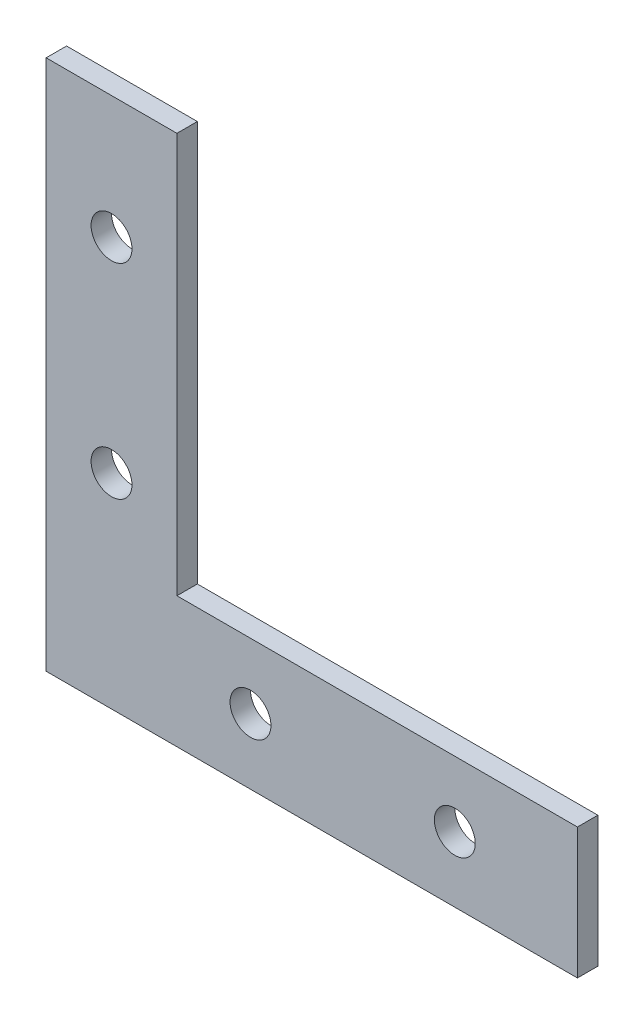
ISO-10303-21;
HEADER;
FILE_DESCRIPTION(('STEP AP214'),'2;1');
FILE_NAME('part.step','',(''),(''),'','','');
FILE_SCHEMA(('AUTOMOTIVE_DESIGN { 1 0 10303 214 1 1 1 1 }'));
ENDSEC;
DATA;
#1=APPLICATION_CONTEXT('core data for automotive mechanical design processes');
#2=APPLICATION_PROTOCOL_DEFINITION('international standard','automotive_design',2000,#1);
#3=PRODUCT_CONTEXT('',#1,'mechanical');
#4=PRODUCT('Part','Part','',(#3));
#5=PRODUCT_RELATED_PRODUCT_CATEGORY('part','',(#4));
#6=PRODUCT_DEFINITION_FORMATION('','',#4);
#7=PRODUCT_DEFINITION_CONTEXT('part definition',#1,'design');
#8=PRODUCT_DEFINITION('design','',#6,#7);
#9=PRODUCT_DEFINITION_SHAPE('','',#8);
#10=(LENGTH_UNIT() NAMED_UNIT(*) SI_UNIT(.MILLI.,.METRE.));
#11=(NAMED_UNIT(*) PLANE_ANGLE_UNIT() SI_UNIT($,.RADIAN.));
#12=(NAMED_UNIT(*) SI_UNIT($,.STERADIAN.) SOLID_ANGLE_UNIT());
#13=UNCERTAINTY_MEASURE_WITH_UNIT(LENGTH_MEASURE(1.E-05),#10,'distance_accuracy_value','');
#14=(GEOMETRIC_REPRESENTATION_CONTEXT(3) GLOBAL_UNCERTAINTY_ASSIGNED_CONTEXT((#13)) GLOBAL_UNIT_ASSIGNED_CONTEXT((#10,
#11,#12)) REPRESENTATION_CONTEXT('',''));
#15=CARTESIAN_POINT('',(0.,0.,0.));
#16=DIRECTION('',(0.,0.,1.));
#17=DIRECTION('',(1.,0.,0.));
#18=AXIS2_PLACEMENT_3D('',#15,#16,#17);
#19=CARTESIAN_POINT('',(0.,0.,1.25));
#20=DIRECTION('',(0.,0.,1.));
#21=DIRECTION('',(1.,0.,0.));
#22=AXIS2_PLACEMENT_3D('',#19,#20,#21);
#23=PLANE('',#22);
#24=CARTESIAN_POINT('',(8.00000000000001,50.,1.25));
#25=DIRECTION('',(0.,0.,1.));
#26=DIRECTION('',(-1.,0.,0.));
#27=AXIS2_PLACEMENT_3D('',#24,#25,#26);
#28=CIRCLE('',#27,2.49999999999999);
#29=CARTESIAN_POINT('',(5.50000000000002,50.,1.25));
#30=VERTEX_POINT('',#29);
#31=EDGE_CURVE('E212',#30,#30,#28,.T.);
#32=ORIENTED_EDGE('',*,*,#31,.F.);
#33=EDGE_LOOP('',(#32));
#34=FACE_BOUND('',#33,.T.);
#35=CARTESIAN_POINT('',(25.,8.,1.25));
#36=DIRECTION('',(0.,0.,1.));
#37=DIRECTION('',(1.,0.,0.));
#38=AXIS2_PLACEMENT_3D('',#35,#36,#37);
#39=CIRCLE('',#38,2.5);
#40=CARTESIAN_POINT('',(27.5,8.,1.25));
#41=VERTEX_POINT('',#40);
#42=EDGE_CURVE('E134',#41,#41,#39,.T.);
#43=ORIENTED_EDGE('',*,*,#42,.F.);
#44=EDGE_LOOP('',(#43));
#45=FACE_BOUND('',#44,.T.);
#46=DIRECTION('',(0.,-1.,0.));
#47=VECTOR('',#46,1.);
#48=CARTESIAN_POINT('',(0.,0.,1.25));
#49=LINE('',#48,#47);
#50=CARTESIAN_POINT('',(0.,65.,1.25));
#51=VERTEX_POINT('',#50);
#52=CARTESIAN_POINT('',(0.,0.,1.25));
#53=VERTEX_POINT('',#52);
#54=EDGE_CURVE('E146',#51,#53,#49,.T.);
#55=ORIENTED_EDGE('',*,*,#54,.T.);
#56=DIRECTION('',(1.,0.,0.));
#57=VECTOR('',#56,1.);
#58=CARTESIAN_POINT('',(0.,0.,1.25));
#59=LINE('',#58,#57);
#60=CARTESIAN_POINT('',(65.,0.,1.25));
#61=VERTEX_POINT('',#60);
#62=EDGE_CURVE('E94',#53,#61,#59,.T.);
#63=ORIENTED_EDGE('',*,*,#62,.T.);
#64=DIRECTION('',(0.,1.,0.));
#65=VECTOR('',#64,1.);
#66=CARTESIAN_POINT('',(65.,0.,1.25));
#67=LINE('',#66,#65);
#68=CARTESIAN_POINT('',(65.,16.,1.25));
#69=VERTEX_POINT('',#68);
#70=EDGE_CURVE('E107',#61,#69,#67,.T.);
#71=ORIENTED_EDGE('',*,*,#70,.T.);
#72=DIRECTION('',(-1.,0.,0.));
#73=VECTOR('',#72,1.);
#74=CARTESIAN_POINT('',(16.,16.,1.25));
#75=LINE('',#74,#73);
#76=CARTESIAN_POINT('',(16.,16.,1.25));
#77=VERTEX_POINT('',#76);
#78=EDGE_CURVE('E101',#69,#77,#75,.T.);
#79=ORIENTED_EDGE('',*,*,#78,.T.);
#80=DIRECTION('',(0.,1.,0.));
#81=VECTOR('',#80,1.);
#82=CARTESIAN_POINT('',(16.,16.,1.25));
#83=LINE('',#82,#81);
#84=CARTESIAN_POINT('',(16.,65.,1.25));
#85=VERTEX_POINT('',#84);
#86=EDGE_CURVE('E105',#77,#85,#83,.T.);
#87=ORIENTED_EDGE('',*,*,#86,.T.);
#88=DIRECTION('',(-1.,0.,0.));
#89=VECTOR('',#88,1.);
#90=CARTESIAN_POINT('',(16.,65.,1.25));
#91=LINE('',#90,#89);
#92=EDGE_CURVE('E57',#85,#51,#91,.T.);
#93=ORIENTED_EDGE('',*,*,#92,.T.);
#94=EDGE_LOOP('',(#55,#63,#71,#79,#87,#93));
#95=FACE_BOUND('',#94,.T.);
#96=CARTESIAN_POINT('',(50.,8.,1.25));
#97=DIRECTION('',(0.,0.,1.));
#98=DIRECTION('',(1.,0.,0.));
#99=AXIS2_PLACEMENT_3D('',#96,#97,#98);
#100=CIRCLE('',#99,2.5);
#101=CARTESIAN_POINT('',(52.5,8.,1.25));
#102=VERTEX_POINT('',#101);
#103=EDGE_CURVE('E220',#102,#102,#100,.T.);
#104=ORIENTED_EDGE('',*,*,#103,.F.);
#105=EDGE_LOOP('',(#104));
#106=FACE_BOUND('',#105,.T.);
#107=CARTESIAN_POINT('',(8.,25.,1.25));
#108=DIRECTION('',(0.,0.,1.));
#109=DIRECTION('',(-1.,0.,0.));
#110=AXIS2_PLACEMENT_3D('',#107,#108,#109);
#111=CIRCLE('',#110,2.49999999999999);
#112=CARTESIAN_POINT('',(5.50000000000001,25.,1.25));
#113=VERTEX_POINT('',#112);
#114=EDGE_CURVE('E201',#113,#113,#111,.T.);
#115=ORIENTED_EDGE('',*,*,#114,.F.);
#116=EDGE_LOOP('',(#115));
#117=FACE_BOUND('',#116,.T.);
#118=ADVANCED_FACE('F39',(#34,#45,#95,#106,#117),#23,.T.);
#119=CARTESIAN_POINT('',(0.,0.,-1.25));
#120=DIRECTION('',(0.,0.,1.));
#121=DIRECTION('',(1.,0.,0.));
#122=AXIS2_PLACEMENT_3D('',#119,#120,#121);
#123=PLANE('',#122);
#124=DIRECTION('',(0.,-1.,0.));
#125=VECTOR('',#124,1.);
#126=CARTESIAN_POINT('',(0.,0.,-1.25));
#127=LINE('',#126,#125);
#128=CARTESIAN_POINT('',(0.,65.,-1.25));
#129=VERTEX_POINT('',#128);
#130=CARTESIAN_POINT('',(0.,0.,-1.25));
#131=VERTEX_POINT('',#130);
#132=EDGE_CURVE('E129',#129,#131,#127,.T.);
#133=ORIENTED_EDGE('',*,*,#132,.F.);
#134=DIRECTION('',(-1.,0.,0.));
#135=VECTOR('',#134,1.);
#136=CARTESIAN_POINT('',(16.,65.,-1.25));
#137=LINE('',#136,#135);
#138=CARTESIAN_POINT('',(16.,65.,-1.25));
#139=VERTEX_POINT('',#138);
#140=EDGE_CURVE('E86',#139,#129,#137,.T.);
#141=ORIENTED_EDGE('',*,*,#140,.F.);
#142=DIRECTION('',(0.,1.,0.));
#143=VECTOR('',#142,1.);
#144=CARTESIAN_POINT('',(16.,16.,-1.25));
#145=LINE('',#144,#143);
#146=CARTESIAN_POINT('',(16.,16.,-1.25));
#147=VERTEX_POINT('',#146);
#148=EDGE_CURVE('E80',#147,#139,#145,.T.);
#149=ORIENTED_EDGE('',*,*,#148,.F.);
#150=DIRECTION('',(-1.,0.,0.));
#151=VECTOR('',#150,1.);
#152=CARTESIAN_POINT('',(16.,16.,-1.25));
#153=LINE('',#152,#151);
#154=CARTESIAN_POINT('',(65.,16.,-1.25));
#155=VERTEX_POINT('',#154);
#156=EDGE_CURVE('E116',#155,#147,#153,.T.);
#157=ORIENTED_EDGE('',*,*,#156,.F.);
#158=DIRECTION('',(0.,1.,0.));
#159=VECTOR('',#158,1.);
#160=CARTESIAN_POINT('',(65.,0.,-1.25));
#161=LINE('',#160,#159);
#162=CARTESIAN_POINT('',(65.,0.,-1.25));
#163=VERTEX_POINT('',#162);
#164=EDGE_CURVE('E137',#163,#155,#161,.T.);
#165=ORIENTED_EDGE('',*,*,#164,.F.);
#166=DIRECTION('',(1.,0.,0.));
#167=VECTOR('',#166,1.);
#168=CARTESIAN_POINT('',(0.,0.,-1.25));
#169=LINE('',#168,#167);
#170=EDGE_CURVE('E133',#131,#163,#169,.T.);
#171=ORIENTED_EDGE('',*,*,#170,.F.);
#172=EDGE_LOOP('',(#133,#141,#149,#157,#165,#171));
#173=FACE_BOUND('',#172,.T.);
#174=CARTESIAN_POINT('',(25.,8.,-1.25));
#175=DIRECTION('',(0.,0.,1.));
#176=DIRECTION('',(1.,0.,0.));
#177=AXIS2_PLACEMENT_3D('',#174,#175,#176);
#178=CIRCLE('',#177,2.5);
#179=CARTESIAN_POINT('',(27.5,8.,-1.25));
#180=VERTEX_POINT('',#179);
#181=EDGE_CURVE('E224',#180,#180,#178,.T.);
#182=ORIENTED_EDGE('',*,*,#181,.T.);
#183=EDGE_LOOP('',(#182));
#184=FACE_BOUND('',#183,.T.);
#185=CARTESIAN_POINT('',(50.,8.,-1.25));
#186=DIRECTION('',(0.,0.,1.));
#187=DIRECTION('',(1.,0.,0.));
#188=AXIS2_PLACEMENT_3D('',#185,#186,#187);
#189=CIRCLE('',#188,2.5);
#190=CARTESIAN_POINT('',(52.5,8.,-1.25));
#191=VERTEX_POINT('',#190);
#192=EDGE_CURVE('E216',#191,#191,#189,.T.);
#193=ORIENTED_EDGE('',*,*,#192,.T.);
#194=EDGE_LOOP('',(#193));
#195=FACE_BOUND('',#194,.T.);
#196=CARTESIAN_POINT('',(8.00000000000001,50.,-1.25));
#197=DIRECTION('',(0.,0.,1.));
#198=DIRECTION('',(-1.,0.,0.));
#199=AXIS2_PLACEMENT_3D('',#196,#197,#198);
#200=CIRCLE('',#199,2.49999999999999);
#201=CARTESIAN_POINT('',(5.50000000000002,50.,-1.25));
#202=VERTEX_POINT('',#201);
#203=EDGE_CURVE('E209',#202,#202,#200,.T.);
#204=ORIENTED_EDGE('',*,*,#203,.T.);
#205=EDGE_LOOP('',(#204));
#206=FACE_BOUND('',#205,.T.);
#207=CARTESIAN_POINT('',(8.,25.,-1.25));
#208=DIRECTION('',(0.,0.,1.));
#209=DIRECTION('',(-1.,0.,0.));
#210=AXIS2_PLACEMENT_3D('',#207,#208,#209);
#211=CIRCLE('',#210,2.49999999999999);
#212=CARTESIAN_POINT('',(5.50000000000001,25.,-1.25));
#213=VERTEX_POINT('',#212);
#214=EDGE_CURVE('E204',#213,#213,#211,.T.);
#215=ORIENTED_EDGE('',*,*,#214,.T.);
#216=EDGE_LOOP('',(#215));
#217=FACE_BOUND('',#216,.T.);
#218=ADVANCED_FACE('F159',(#173,#184,#195,#206,#217),#123,.F.);
#219=CARTESIAN_POINT('',(0.,0.,1.25));
#220=DIRECTION('',(1.,0.,0.));
#221=DIRECTION('',(0.,0.,-1.));
#222=AXIS2_PLACEMENT_3D('',#219,#220,#221);
#223=PLANE('',#222);
#224=ORIENTED_EDGE('',*,*,#132,.T.);
#225=DIRECTION('',(0.,0.,-1.));
#226=VECTOR('',#225,1.);
#227=CARTESIAN_POINT('',(0.,0.,1.25));
#228=LINE('',#227,#226);
#229=EDGE_CURVE('E11',#53,#131,#228,.T.);
#230=ORIENTED_EDGE('',*,*,#229,.F.);
#231=ORIENTED_EDGE('',*,*,#54,.F.);
#232=DIRECTION('',(0.,0.,-1.));
#233=VECTOR('',#232,1.);
#234=CARTESIAN_POINT('',(0.,65.,1.25));
#235=LINE('',#234,#233);
#236=EDGE_CURVE('E125',#51,#129,#235,.T.);
#237=ORIENTED_EDGE('',*,*,#236,.T.);
#238=EDGE_LOOP('',(#224,#230,#231,#237));
#239=FACE_BOUND('',#238,.T.);
#240=ADVANCED_FACE('F41',(#239),#223,.F.);
#241=CARTESIAN_POINT('',(0.,0.,1.25));
#242=DIRECTION('',(0.,1.,0.));
#243=DIRECTION('',(0.,0.,1.));
#244=AXIS2_PLACEMENT_3D('',#241,#242,#243);
#245=PLANE('',#244);
#246=ORIENTED_EDGE('',*,*,#170,.T.);
#247=DIRECTION('',(0.,0.,-1.));
#248=VECTOR('',#247,1.);
#249=CARTESIAN_POINT('',(65.,0.,1.25));
#250=LINE('',#249,#248);
#251=EDGE_CURVE('E49',#61,#163,#250,.T.);
#252=ORIENTED_EDGE('',*,*,#251,.F.);
#253=ORIENTED_EDGE('',*,*,#62,.F.);
#254=ORIENTED_EDGE('',*,*,#229,.T.);
#255=EDGE_LOOP('',(#246,#252,#253,#254));
#256=FACE_BOUND('',#255,.T.);
#257=ADVANCED_FACE('F288',(#256),#245,.F.);
#258=CARTESIAN_POINT('',(65.,0.,1.25));
#259=DIRECTION('',(-1.,0.,0.));
#260=DIRECTION('',(0.,0.,1.));
#261=AXIS2_PLACEMENT_3D('',#258,#259,#260);
#262=PLANE('',#261);
#263=ORIENTED_EDGE('',*,*,#164,.T.);
#264=DIRECTION('',(0.,0.,-1.));
#265=VECTOR('',#264,1.);
#266=CARTESIAN_POINT('',(65.,16.,1.25));
#267=LINE('',#266,#265);
#268=EDGE_CURVE('E118',#69,#155,#267,.T.);
#269=ORIENTED_EDGE('',*,*,#268,.F.);
#270=ORIENTED_EDGE('',*,*,#70,.F.);
#271=ORIENTED_EDGE('',*,*,#251,.T.);
#272=EDGE_LOOP('',(#263,#269,#270,#271));
#273=FACE_BOUND('',#272,.T.);
#274=ADVANCED_FACE('F156',(#273),#262,.F.);
#275=CARTESIAN_POINT('',(16.,16.,1.25));
#276=DIRECTION('',(0.,-1.,0.));
#277=DIRECTION('',(0.,0.,-1.));
#278=AXIS2_PLACEMENT_3D('',#275,#276,#277);
#279=PLANE('',#278);
#280=ORIENTED_EDGE('',*,*,#156,.T.);
#281=DIRECTION('',(0.,0.,-1.));
#282=VECTOR('',#281,1.);
#283=CARTESIAN_POINT('',(16.,16.,1.25));
#284=LINE('',#283,#282);
#285=EDGE_CURVE('E113',#77,#147,#284,.T.);
#286=ORIENTED_EDGE('',*,*,#285,.F.);
#287=ORIENTED_EDGE('',*,*,#78,.F.);
#288=ORIENTED_EDGE('',*,*,#268,.T.);
#289=EDGE_LOOP('',(#280,#286,#287,#288));
#290=FACE_BOUND('',#289,.T.);
#291=ADVANCED_FACE('F114',(#290),#279,.F.);
#292=CARTESIAN_POINT('',(16.,16.,1.25));
#293=DIRECTION('',(-1.,0.,0.));
#294=DIRECTION('',(0.,0.,1.));
#295=AXIS2_PLACEMENT_3D('',#292,#293,#294);
#296=PLANE('',#295);
#297=ORIENTED_EDGE('',*,*,#148,.T.);
#298=DIRECTION('',(0.,0.,-1.));
#299=VECTOR('',#298,1.);
#300=CARTESIAN_POINT('',(16.,65.,1.25));
#301=LINE('',#300,#299);
#302=EDGE_CURVE('E119',#85,#139,#301,.T.);
#303=ORIENTED_EDGE('',*,*,#302,.F.);
#304=ORIENTED_EDGE('',*,*,#86,.F.);
#305=ORIENTED_EDGE('',*,*,#285,.T.);
#306=EDGE_LOOP('',(#297,#303,#304,#305));
#307=FACE_BOUND('',#306,.T.);
#308=ADVANCED_FACE('F121',(#307),#296,.F.);
#309=CARTESIAN_POINT('',(16.,65.,1.25));
#310=DIRECTION('',(0.,-1.,0.));
#311=DIRECTION('',(0.,0.,-1.));
#312=AXIS2_PLACEMENT_3D('',#309,#310,#311);
#313=PLANE('',#312);
#314=ORIENTED_EDGE('',*,*,#140,.T.);
#315=ORIENTED_EDGE('',*,*,#236,.F.);
#316=ORIENTED_EDGE('',*,*,#92,.F.);
#317=ORIENTED_EDGE('',*,*,#302,.T.);
#318=EDGE_LOOP('',(#314,#315,#316,#317));
#319=FACE_BOUND('',#318,.T.);
#320=ADVANCED_FACE('F164',(#319),#313,.F.);
#321=CARTESIAN_POINT('',(25.,8.,1.25));
#322=DIRECTION('',(0.,0.,-1.));
#323=DIRECTION('',(-1.,0.,0.));
#324=AXIS2_PLACEMENT_3D('',#321,#322,#323);
#325=CYLINDRICAL_SURFACE('',#324,2.5);
#326=ORIENTED_EDGE('',*,*,#42,.T.);
#327=EDGE_LOOP('',(#326));
#328=FACE_BOUND('',#327,.T.);
#329=ORIENTED_EDGE('',*,*,#181,.F.);
#330=EDGE_LOOP('',(#329));
#331=FACE_BOUND('',#330,.T.);
#332=ADVANCED_FACE('F166',(#328,#331),#325,.F.);
#333=CARTESIAN_POINT('',(50.,8.,1.25));
#334=DIRECTION('',(0.,0.,-1.));
#335=DIRECTION('',(-1.,0.,0.));
#336=AXIS2_PLACEMENT_3D('',#333,#334,#335);
#337=CYLINDRICAL_SURFACE('',#336,2.5);
#338=ORIENTED_EDGE('',*,*,#103,.T.);
#339=EDGE_LOOP('',(#338));
#340=FACE_BOUND('',#339,.T.);
#341=ORIENTED_EDGE('',*,*,#192,.F.);
#342=EDGE_LOOP('',(#341));
#343=FACE_BOUND('',#342,.T.);
#344=ADVANCED_FACE('F172',(#340,#343),#337,.F.);
#345=CARTESIAN_POINT('',(8.00000000000001,50.,1.25));
#346=DIRECTION('',(0.,0.,-1.));
#347=DIRECTION('',(-1.,0.,0.));
#348=AXIS2_PLACEMENT_3D('',#345,#346,#347);
#349=CYLINDRICAL_SURFACE('',#348,2.49999999999999);
#350=ORIENTED_EDGE('',*,*,#31,.T.);
#351=EDGE_LOOP('',(#350));
#352=FACE_BOUND('',#351,.T.);
#353=ORIENTED_EDGE('',*,*,#203,.F.);
#354=EDGE_LOOP('',(#353));
#355=FACE_BOUND('',#354,.T.);
#356=ADVANCED_FACE('F188',(#352,#355),#349,.F.);
#357=CARTESIAN_POINT('',(8.,25.,1.25));
#358=DIRECTION('',(0.,0.,-1.));
#359=DIRECTION('',(-1.,0.,0.));
#360=AXIS2_PLACEMENT_3D('',#357,#358,#359);
#361=CYLINDRICAL_SURFACE('',#360,2.49999999999999);
#362=ORIENTED_EDGE('',*,*,#114,.T.);
#363=EDGE_LOOP('',(#362));
#364=FACE_BOUND('',#363,.T.);
#365=ORIENTED_EDGE('',*,*,#214,.F.);
#366=EDGE_LOOP('',(#365));
#367=FACE_BOUND('',#366,.T.);
#368=ADVANCED_FACE('F192',(#364,#367),#361,.F.);
#369=CLOSED_SHELL('',(#118,#218,#240,#257,#274,#291,#308,#320,#332,#344,#356,#368));
#370=MANIFOLD_SOLID_BREP('B2',#369);
#371=ADVANCED_BREP_SHAPE_REPRESENTATION('',(#18,#370),#14);
#372=SHAPE_DEFINITION_REPRESENTATION(#9,#371);
ENDSEC;
END-ISO-10303-21;
